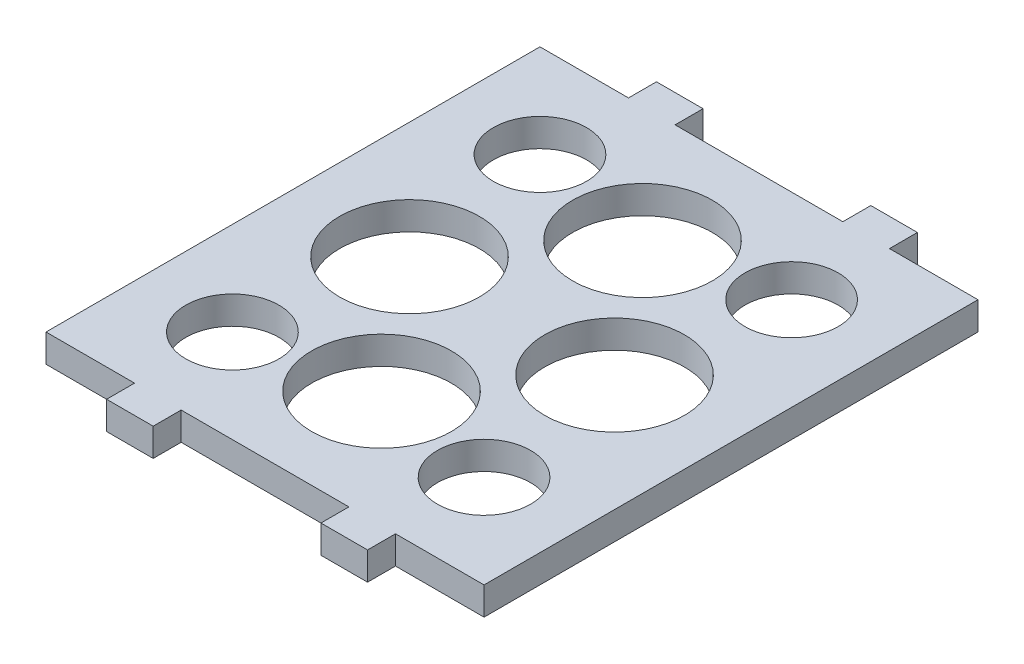
ISO-10303-21;
HEADER;
FILE_DESCRIPTION(('STEP AP214'),'2;1');
FILE_NAME('part.step','',(''),(''),'','','');
FILE_SCHEMA(('AUTOMOTIVE_DESIGN { 1 0 10303 214 1 1 1 1 }'));
ENDSEC;
DATA;
#1=APPLICATION_CONTEXT('core data for automotive mechanical design processes');
#2=APPLICATION_PROTOCOL_DEFINITION('international standard','automotive_design',2000,#1);
#3=PRODUCT_CONTEXT('',#1,'mechanical');
#4=PRODUCT('Part','Part','',(#3));
#5=PRODUCT_RELATED_PRODUCT_CATEGORY('part','',(#4));
#6=PRODUCT_DEFINITION_FORMATION('','',#4);
#7=PRODUCT_DEFINITION_CONTEXT('part definition',#1,'design');
#8=PRODUCT_DEFINITION('design','',#6,#7);
#9=PRODUCT_DEFINITION_SHAPE('','',#8);
#10=(LENGTH_UNIT() NAMED_UNIT(*) SI_UNIT(.MILLI.,.METRE.));
#11=(NAMED_UNIT(*) PLANE_ANGLE_UNIT() SI_UNIT($,.RADIAN.));
#12=(NAMED_UNIT(*) SI_UNIT($,.STERADIAN.) SOLID_ANGLE_UNIT());
#13=UNCERTAINTY_MEASURE_WITH_UNIT(LENGTH_MEASURE(1.E-05),#10,'distance_accuracy_value','');
#14=(GEOMETRIC_REPRESENTATION_CONTEXT(3) GLOBAL_UNCERTAINTY_ASSIGNED_CONTEXT((#13)) GLOBAL_UNIT_ASSIGNED_CONTEXT((#10,
#11,#12)) REPRESENTATION_CONTEXT('',''));
#15=CARTESIAN_POINT('',(0.,0.,0.));
#16=DIRECTION('',(0.,0.,1.));
#17=DIRECTION('',(1.,0.,0.));
#18=AXIS2_PLACEMENT_3D('',#15,#16,#17);
#19=CARTESIAN_POINT('',(0.,6.,0.));
#20=DIRECTION('',(0.,-1.,0.));
#21=DIRECTION('',(0.,0.,-1.));
#22=AXIS2_PLACEMENT_3D('',#19,#20,#21);
#23=PLANE('',#22);
#24=CARTESIAN_POINT('',(74.,6.,-86.));
#25=DIRECTION('',(0.,1.,0.));
#26=DIRECTION('',(0.,0.,1.));
#27=AXIS2_PLACEMENT_3D('',#24,#25,#26);
#28=CIRCLE('',#27,9.99999999999999);
#29=CARTESIAN_POINT('',(74.,6.,-76.));
#30=VERTEX_POINT('',#29);
#31=EDGE_CURVE('E411',#30,#30,#28,.T.);
#32=ORIENTED_EDGE('',*,*,#31,.F.);
#33=EDGE_LOOP('',(#32));
#34=FACE_BOUND('',#33,.T.);
#35=CARTESIAN_POINT('',(20.,6.,-20.));
#36=DIRECTION('',(0.,1.,0.));
#37=DIRECTION('',(0.,0.,1.));
#38=AXIS2_PLACEMENT_3D('',#35,#36,#37);
#39=CIRCLE('',#38,10.);
#40=CARTESIAN_POINT('',(20.,6.,-9.99999999999999));
#41=VERTEX_POINT('',#40);
#42=EDGE_CURVE('E423',#41,#41,#39,.T.);
#43=ORIENTED_EDGE('',*,*,#42,.F.);
#44=EDGE_LOOP('',(#43));
#45=FACE_BOUND('',#44,.T.);
#46=CARTESIAN_POINT('',(47.,6.,-81.));
#47=DIRECTION('',(0.,1.,0.));
#48=DIRECTION('',(0.,0.,1.));
#49=AXIS2_PLACEMENT_3D('',#46,#47,#48);
#50=CIRCLE('',#49,15.);
#51=CARTESIAN_POINT('',(47.,6.,-66.));
#52=VERTEX_POINT('',#51);
#53=EDGE_CURVE('E435',#52,#52,#50,.T.);
#54=ORIENTED_EDGE('',*,*,#53,.F.);
#55=EDGE_LOOP('',(#54));
#56=FACE_BOUND('',#55,.T.);
#57=CARTESIAN_POINT('',(25.,6.,-53.));
#58=DIRECTION('',(0.,1.,0.));
#59=DIRECTION('',(0.,0.,1.));
#60=AXIS2_PLACEMENT_3D('',#57,#58,#59);
#61=CIRCLE('',#60,15.);
#62=CARTESIAN_POINT('',(25.,6.,-38.));
#63=VERTEX_POINT('',#62);
#64=EDGE_CURVE('E205',#63,#63,#61,.T.);
#65=ORIENTED_EDGE('',*,*,#64,.F.);
#66=EDGE_LOOP('',(#65));
#67=FACE_BOUND('',#66,.T.);
#68=DIRECTION('',(0.,0.,1.));
#69=VECTOR('',#68,1.);
#70=CARTESIAN_POINT('',(0.,6.,0.));
#71=LINE('',#70,#69);
#72=CARTESIAN_POINT('',(0.,6.,-106.));
#73=VERTEX_POINT('',#72);
#74=CARTESIAN_POINT('',(0.,6.,0.));
#75=VERTEX_POINT('',#74);
#76=EDGE_CURVE('E240',#73,#75,#71,.T.);
#77=ORIENTED_EDGE('',*,*,#76,.T.);
#78=DIRECTION('',(1.,0.,0.));
#79=VECTOR('',#78,1.);
#80=CARTESIAN_POINT('',(0.,6.,0.));
#81=LINE('',#80,#79);
#82=CARTESIAN_POINT('',(19.,6.,0.));
#83=VERTEX_POINT('',#82);
#84=EDGE_CURVE('E128',#75,#83,#81,.T.);
#85=ORIENTED_EDGE('',*,*,#84,.T.);
#86=DIRECTION('',(0.,0.,1.));
#87=VECTOR('',#86,1.);
#88=CARTESIAN_POINT('',(19.,6.,0.));
#89=LINE('',#88,#87);
#90=CARTESIAN_POINT('',(19.,6.,6.));
#91=VERTEX_POINT('',#90);
#92=EDGE_CURVE('E291',#83,#91,#89,.T.);
#93=ORIENTED_EDGE('',*,*,#92,.T.);
#94=DIRECTION('',(1.,0.,0.));
#95=VECTOR('',#94,1.);
#96=CARTESIAN_POINT('',(19.,6.,6.));
#97=LINE('',#96,#95);
#98=CARTESIAN_POINT('',(29.,6.,6.));
#99=VERTEX_POINT('',#98);
#100=EDGE_CURVE('E310',#91,#99,#97,.T.);
#101=ORIENTED_EDGE('',*,*,#100,.T.);
#102=DIRECTION('',(0.,0.,-1.));
#103=VECTOR('',#102,1.);
#104=CARTESIAN_POINT('',(29.,6.,6.));
#105=LINE('',#104,#103);
#106=CARTESIAN_POINT('',(29.,6.,0.));
#107=VERTEX_POINT('',#106);
#108=EDGE_CURVE('E307',#99,#107,#105,.T.);
#109=ORIENTED_EDGE('',*,*,#108,.T.);
#110=DIRECTION('',(1.,0.,0.));
#111=VECTOR('',#110,1.);
#112=CARTESIAN_POINT('',(29.,6.,0.));
#113=LINE('',#112,#111);
#114=CARTESIAN_POINT('',(65.,6.,0.));
#115=VERTEX_POINT('',#114);
#116=EDGE_CURVE('E309',#107,#115,#113,.T.);
#117=ORIENTED_EDGE('',*,*,#116,.T.);
#118=DIRECTION('',(0.,0.,1.));
#119=VECTOR('',#118,1.);
#120=CARTESIAN_POINT('',(65.,6.,0.));
#121=LINE('',#120,#119);
#122=CARTESIAN_POINT('',(65.,6.,6.));
#123=VERTEX_POINT('',#122);
#124=EDGE_CURVE('E312',#115,#123,#121,.T.);
#125=ORIENTED_EDGE('',*,*,#124,.T.);
#126=DIRECTION('',(1.,0.,0.));
#127=VECTOR('',#126,1.);
#128=CARTESIAN_POINT('',(65.,6.,6.));
#129=LINE('',#128,#127);
#130=CARTESIAN_POINT('',(75.,6.,6.));
#131=VERTEX_POINT('',#130);
#132=EDGE_CURVE('E318',#123,#131,#129,.T.);
#133=ORIENTED_EDGE('',*,*,#132,.T.);
#134=DIRECTION('',(0.,0.,-1.));
#135=VECTOR('',#134,1.);
#136=CARTESIAN_POINT('',(75.,6.,6.));
#137=LINE('',#136,#135);
#138=CARTESIAN_POINT('',(75.,6.,0.));
#139=VERTEX_POINT('',#138);
#140=EDGE_CURVE('E320',#131,#139,#137,.T.);
#141=ORIENTED_EDGE('',*,*,#140,.T.);
#142=DIRECTION('',(1.,0.,0.));
#143=VECTOR('',#142,1.);
#144=CARTESIAN_POINT('',(75.,6.,0.));
#145=LINE('',#144,#143);
#146=CARTESIAN_POINT('',(94.,6.,0.));
#147=VERTEX_POINT('',#146);
#148=EDGE_CURVE('E322',#139,#147,#145,.T.);
#149=ORIENTED_EDGE('',*,*,#148,.T.);
#150=DIRECTION('',(0.,0.,-1.));
#151=VECTOR('',#150,1.);
#152=CARTESIAN_POINT('',(94.,6.,0.));
#153=LINE('',#152,#151);
#154=CARTESIAN_POINT('',(94.,6.,-106.));
#155=VERTEX_POINT('',#154);
#156=EDGE_CURVE('E324',#147,#155,#153,.T.);
#157=ORIENTED_EDGE('',*,*,#156,.T.);
#158=DIRECTION('',(-1.,0.,0.));
#159=VECTOR('',#158,1.);
#160=CARTESIAN_POINT('',(75.,6.,-106.));
#161=LINE('',#160,#159);
#162=CARTESIAN_POINT('',(75.,6.,-106.));
#163=VERTEX_POINT('',#162);
#164=EDGE_CURVE('E326',#155,#163,#161,.T.);
#165=ORIENTED_EDGE('',*,*,#164,.T.);
#166=DIRECTION('',(0.,0.,-1.));
#167=VECTOR('',#166,1.);
#168=CARTESIAN_POINT('',(75.,6.,-112.));
#169=LINE('',#168,#167);
#170=CARTESIAN_POINT('',(75.,6.,-112.));
#171=VERTEX_POINT('',#170);
#172=EDGE_CURVE('E328',#163,#171,#169,.T.);
#173=ORIENTED_EDGE('',*,*,#172,.T.);
#174=DIRECTION('',(-1.,0.,0.));
#175=VECTOR('',#174,1.);
#176=CARTESIAN_POINT('',(65.,6.,-112.));
#177=LINE('',#176,#175);
#178=CARTESIAN_POINT('',(65.,6.,-112.));
#179=VERTEX_POINT('',#178);
#180=EDGE_CURVE('E330',#171,#179,#177,.T.);
#181=ORIENTED_EDGE('',*,*,#180,.T.);
#182=DIRECTION('',(0.,0.,1.));
#183=VECTOR('',#182,1.);
#184=CARTESIAN_POINT('',(65.,6.,-106.));
#185=LINE('',#184,#183);
#186=CARTESIAN_POINT('',(65.,6.,-106.));
#187=VERTEX_POINT('',#186);
#188=EDGE_CURVE('E332',#179,#187,#185,.T.);
#189=ORIENTED_EDGE('',*,*,#188,.T.);
#190=DIRECTION('',(-1.,0.,0.));
#191=VECTOR('',#190,1.);
#192=CARTESIAN_POINT('',(29.,6.,-106.));
#193=LINE('',#192,#191);
#194=CARTESIAN_POINT('',(29.,6.,-106.));
#195=VERTEX_POINT('',#194);
#196=EDGE_CURVE('E334',#187,#195,#193,.T.);
#197=ORIENTED_EDGE('',*,*,#196,.T.);
#198=DIRECTION('',(0.,0.,-1.));
#199=VECTOR('',#198,1.);
#200=CARTESIAN_POINT('',(29.,6.,-112.));
#201=LINE('',#200,#199);
#202=CARTESIAN_POINT('',(29.,6.,-112.));
#203=VERTEX_POINT('',#202);
#204=EDGE_CURVE('E183',#195,#203,#201,.T.);
#205=ORIENTED_EDGE('',*,*,#204,.T.);
#206=DIRECTION('',(-1.,0.,0.));
#207=VECTOR('',#206,1.);
#208=CARTESIAN_POINT('',(19.,6.,-112.));
#209=LINE('',#208,#207);
#210=CARTESIAN_POINT('',(19.,6.,-112.));
#211=VERTEX_POINT('',#210);
#212=EDGE_CURVE('E177',#203,#211,#209,.T.);
#213=ORIENTED_EDGE('',*,*,#212,.T.);
#214=DIRECTION('',(0.,0.,1.));
#215=VECTOR('',#214,1.);
#216=CARTESIAN_POINT('',(19.,6.,-106.));
#217=LINE('',#216,#215);
#218=CARTESIAN_POINT('',(19.,6.,-106.));
#219=VERTEX_POINT('',#218);
#220=EDGE_CURVE('E181',#211,#219,#217,.T.);
#221=ORIENTED_EDGE('',*,*,#220,.T.);
#222=DIRECTION('',(-1.,0.,0.));
#223=VECTOR('',#222,1.);
#224=CARTESIAN_POINT('',(0.,6.,-106.));
#225=LINE('',#224,#223);
#226=EDGE_CURVE('E49',#219,#73,#225,.T.);
#227=ORIENTED_EDGE('',*,*,#226,.T.);
#228=EDGE_LOOP('',(#77,#85,#93,#101,#109,#117,#125,#133,#141,#149,#157,#165,#173,#181,#189,#197,
#205,#213,#221,#227));
#229=FACE_BOUND('',#228,.T.);
#230=CARTESIAN_POINT('',(69.,6.,-53.));
#231=DIRECTION('',(0.,1.,0.));
#232=DIRECTION('',(0.,0.,1.));
#233=AXIS2_PLACEMENT_3D('',#230,#231,#232);
#234=CIRCLE('',#233,15.);
#235=CARTESIAN_POINT('',(69.,6.,-38.));
#236=VERTEX_POINT('',#235);
#237=EDGE_CURVE('E441',#236,#236,#234,.T.);
#238=ORIENTED_EDGE('',*,*,#237,.F.);
#239=EDGE_LOOP('',(#238));
#240=FACE_BOUND('',#239,.T.);
#241=CARTESIAN_POINT('',(47.,6.,-25.));
#242=DIRECTION('',(0.,1.,0.));
#243=DIRECTION('',(0.,0.,1.));
#244=AXIS2_PLACEMENT_3D('',#241,#242,#243);
#245=CIRCLE('',#244,15.);
#246=CARTESIAN_POINT('',(47.,6.,-10.));
#247=VERTEX_POINT('',#246);
#248=EDGE_CURVE('E429',#247,#247,#245,.T.);
#249=ORIENTED_EDGE('',*,*,#248,.F.);
#250=EDGE_LOOP('',(#249));
#251=FACE_BOUND('',#250,.T.);
#252=CARTESIAN_POINT('',(20.,6.,-86.));
#253=DIRECTION('',(0.,1.,0.));
#254=DIRECTION('',(0.,0.,1.));
#255=AXIS2_PLACEMENT_3D('',#252,#253,#254);
#256=CIRCLE('',#255,9.99999999999999);
#257=CARTESIAN_POINT('',(20.,6.,-76.));
#258=VERTEX_POINT('',#257);
#259=EDGE_CURVE('E417',#258,#258,#256,.T.);
#260=ORIENTED_EDGE('',*,*,#259,.F.);
#261=EDGE_LOOP('',(#260));
#262=FACE_BOUND('',#261,.T.);
#263=CARTESIAN_POINT('',(74.,6.,-20.));
#264=DIRECTION('',(0.,1.,0.));
#265=DIRECTION('',(0.,0.,1.));
#266=AXIS2_PLACEMENT_3D('',#263,#264,#265);
#267=CIRCLE('',#266,9.99999999999999);
#268=CARTESIAN_POINT('',(74.,6.,-10.));
#269=VERTEX_POINT('',#268);
#270=EDGE_CURVE('E402',#269,#269,#267,.T.);
#271=ORIENTED_EDGE('',*,*,#270,.F.);
#272=EDGE_LOOP('',(#271));
#273=FACE_BOUND('',#272,.T.);
#274=ADVANCED_FACE('F32',(#34,#45,#56,#67,#229,#240,#251,#262,#273),#23,.F.);
#275=CARTESIAN_POINT('',(0.,0.,0.));
#276=DIRECTION('',(0.,-1.,0.));
#277=DIRECTION('',(0.,0.,-1.));
#278=AXIS2_PLACEMENT_3D('',#275,#276,#277);
#279=PLANE('',#278);
#280=CARTESIAN_POINT('',(74.,0.,-86.));
#281=DIRECTION('',(0.,1.,0.));
#282=DIRECTION('',(0.,0.,1.));
#283=AXIS2_PLACEMENT_3D('',#280,#281,#282);
#284=CIRCLE('',#283,9.99999999999999);
#285=CARTESIAN_POINT('',(74.,0.,-76.));
#286=VERTEX_POINT('',#285);
#287=EDGE_CURVE('E408',#286,#286,#284,.T.);
#288=ORIENTED_EDGE('',*,*,#287,.T.);
#289=EDGE_LOOP('',(#288));
#290=FACE_BOUND('',#289,.T.);
#291=CARTESIAN_POINT('',(20.,0.,-20.));
#292=DIRECTION('',(0.,1.,0.));
#293=DIRECTION('',(0.,0.,1.));
#294=AXIS2_PLACEMENT_3D('',#291,#292,#293);
#295=CIRCLE('',#294,10.);
#296=CARTESIAN_POINT('',(20.,0.,-9.99999999999999));
#297=VERTEX_POINT('',#296);
#298=EDGE_CURVE('E420',#297,#297,#295,.T.);
#299=ORIENTED_EDGE('',*,*,#298,.T.);
#300=EDGE_LOOP('',(#299));
#301=FACE_BOUND('',#300,.T.);
#302=CARTESIAN_POINT('',(47.,0.,-81.));
#303=DIRECTION('',(0.,1.,0.));
#304=DIRECTION('',(0.,0.,1.));
#305=AXIS2_PLACEMENT_3D('',#302,#303,#304);
#306=CIRCLE('',#305,15.);
#307=CARTESIAN_POINT('',(47.,0.,-66.));
#308=VERTEX_POINT('',#307);
#309=EDGE_CURVE('E432',#308,#308,#306,.T.);
#310=ORIENTED_EDGE('',*,*,#309,.T.);
#311=EDGE_LOOP('',(#310));
#312=FACE_BOUND('',#311,.T.);
#313=CARTESIAN_POINT('',(25.,0.,-53.));
#314=DIRECTION('',(0.,1.,0.));
#315=DIRECTION('',(0.,0.,1.));
#316=AXIS2_PLACEMENT_3D('',#313,#314,#315);
#317=CIRCLE('',#316,15.);
#318=CARTESIAN_POINT('',(25.,0.,-38.));
#319=VERTEX_POINT('',#318);
#320=EDGE_CURVE('E444',#319,#319,#317,.T.);
#321=ORIENTED_EDGE('',*,*,#320,.T.);
#322=EDGE_LOOP('',(#321));
#323=FACE_BOUND('',#322,.T.);
#324=DIRECTION('',(0.,0.,1.));
#325=VECTOR('',#324,1.);
#326=CARTESIAN_POINT('',(0.,0.,0.));
#327=LINE('',#326,#325);
#328=CARTESIAN_POINT('',(0.,0.,-106.));
#329=VERTEX_POINT('',#328);
#330=CARTESIAN_POINT('',(0.,0.,0.));
#331=VERTEX_POINT('',#330);
#332=EDGE_CURVE('E201',#329,#331,#327,.T.);
#333=ORIENTED_EDGE('',*,*,#332,.F.);
#334=DIRECTION('',(-1.,0.,0.));
#335=VECTOR('',#334,1.);
#336=CARTESIAN_POINT('',(0.,0.,-106.));
#337=LINE('',#336,#335);
#338=CARTESIAN_POINT('',(19.,0.,-106.));
#339=VERTEX_POINT('',#338);
#340=EDGE_CURVE('E120',#339,#329,#337,.T.);
#341=ORIENTED_EDGE('',*,*,#340,.F.);
#342=DIRECTION('',(0.,0.,1.));
#343=VECTOR('',#342,1.);
#344=CARTESIAN_POINT('',(19.,0.,-106.));
#345=LINE('',#344,#343);
#346=CARTESIAN_POINT('',(19.,0.,-112.));
#347=VERTEX_POINT('',#346);
#348=EDGE_CURVE('E114',#347,#339,#345,.T.);
#349=ORIENTED_EDGE('',*,*,#348,.F.);
#350=DIRECTION('',(-1.,0.,0.));
#351=VECTOR('',#350,1.);
#352=CARTESIAN_POINT('',(19.,0.,-112.));
#353=LINE('',#352,#351);
#354=CARTESIAN_POINT('',(29.,0.,-112.));
#355=VERTEX_POINT('',#354);
#356=EDGE_CURVE('E191',#355,#347,#353,.T.);
#357=ORIENTED_EDGE('',*,*,#356,.F.);
#358=DIRECTION('',(0.,0.,-1.));
#359=VECTOR('',#358,1.);
#360=CARTESIAN_POINT('',(29.,0.,-112.));
#361=LINE('',#360,#359);
#362=CARTESIAN_POINT('',(29.,0.,-106.));
#363=VERTEX_POINT('',#362);
#364=EDGE_CURVE('E235',#363,#355,#361,.T.);
#365=ORIENTED_EDGE('',*,*,#364,.F.);
#366=DIRECTION('',(-1.,0.,0.));
#367=VECTOR('',#366,1.);
#368=CARTESIAN_POINT('',(29.,0.,-106.));
#369=LINE('',#368,#367);
#370=CARTESIAN_POINT('',(65.,0.,-106.));
#371=VERTEX_POINT('',#370);
#372=EDGE_CURVE('E233',#371,#363,#369,.T.);
#373=ORIENTED_EDGE('',*,*,#372,.F.);
#374=DIRECTION('',(0.,0.,1.));
#375=VECTOR('',#374,1.);
#376=CARTESIAN_POINT('',(65.,0.,-106.));
#377=LINE('',#376,#375);
#378=CARTESIAN_POINT('',(65.,0.,-112.));
#379=VERTEX_POINT('',#378);
#380=EDGE_CURVE('E231',#379,#371,#377,.T.);
#381=ORIENTED_EDGE('',*,*,#380,.F.);
#382=DIRECTION('',(-1.,0.,0.));
#383=VECTOR('',#382,1.);
#384=CARTESIAN_POINT('',(65.,0.,-112.));
#385=LINE('',#384,#383);
#386=CARTESIAN_POINT('',(75.,0.,-112.));
#387=VERTEX_POINT('',#386);
#388=EDGE_CURVE('E229',#387,#379,#385,.T.);
#389=ORIENTED_EDGE('',*,*,#388,.F.);
#390=DIRECTION('',(0.,0.,-1.));
#391=VECTOR('',#390,1.);
#392=CARTESIAN_POINT('',(75.,0.,-112.));
#393=LINE('',#392,#391);
#394=CARTESIAN_POINT('',(75.,0.,-106.));
#395=VERTEX_POINT('',#394);
#396=EDGE_CURVE('E227',#395,#387,#393,.T.);
#397=ORIENTED_EDGE('',*,*,#396,.F.);
#398=DIRECTION('',(-1.,0.,0.));
#399=VECTOR('',#398,1.);
#400=CARTESIAN_POINT('',(75.,0.,-106.));
#401=LINE('',#400,#399);
#402=CARTESIAN_POINT('',(94.,0.,-106.));
#403=VERTEX_POINT('',#402);
#404=EDGE_CURVE('E225',#403,#395,#401,.T.);
#405=ORIENTED_EDGE('',*,*,#404,.F.);
#406=DIRECTION('',(0.,0.,-1.));
#407=VECTOR('',#406,1.);
#408=CARTESIAN_POINT('',(94.,0.,0.));
#409=LINE('',#408,#407);
#410=CARTESIAN_POINT('',(94.,0.,0.));
#411=VERTEX_POINT('',#410);
#412=EDGE_CURVE('E223',#411,#403,#409,.T.);
#413=ORIENTED_EDGE('',*,*,#412,.F.);
#414=DIRECTION('',(1.,0.,0.));
#415=VECTOR('',#414,1.);
#416=CARTESIAN_POINT('',(75.,0.,0.));
#417=LINE('',#416,#415);
#418=CARTESIAN_POINT('',(75.,0.,0.));
#419=VERTEX_POINT('',#418);
#420=EDGE_CURVE('E221',#419,#411,#417,.T.);
#421=ORIENTED_EDGE('',*,*,#420,.F.);
#422=DIRECTION('',(0.,0.,-1.));
#423=VECTOR('',#422,1.);
#424=CARTESIAN_POINT('',(75.,0.,6.));
#425=LINE('',#424,#423);
#426=CARTESIAN_POINT('',(75.,0.,6.));
#427=VERTEX_POINT('',#426);
#428=EDGE_CURVE('E219',#427,#419,#425,.T.);
#429=ORIENTED_EDGE('',*,*,#428,.F.);
#430=DIRECTION('',(1.,0.,0.));
#431=VECTOR('',#430,1.);
#432=CARTESIAN_POINT('',(65.,0.,6.));
#433=LINE('',#432,#431);
#434=CARTESIAN_POINT('',(65.,0.,6.));
#435=VERTEX_POINT('',#434);
#436=EDGE_CURVE('E217',#435,#427,#433,.T.);
#437=ORIENTED_EDGE('',*,*,#436,.F.);
#438=DIRECTION('',(0.,0.,1.));
#439=VECTOR('',#438,1.);
#440=CARTESIAN_POINT('',(65.,0.,0.));
#441=LINE('',#440,#439);
#442=CARTESIAN_POINT('',(65.,0.,0.));
#443=VERTEX_POINT('',#442);
#444=EDGE_CURVE('E215',#443,#435,#441,.T.);
#445=ORIENTED_EDGE('',*,*,#444,.F.);
#446=DIRECTION('',(1.,0.,0.));
#447=VECTOR('',#446,1.);
#448=CARTESIAN_POINT('',(29.,0.,0.));
#449=LINE('',#448,#447);
#450=CARTESIAN_POINT('',(29.,0.,0.));
#451=VERTEX_POINT('',#450);
#452=EDGE_CURVE('E213',#451,#443,#449,.T.);
#453=ORIENTED_EDGE('',*,*,#452,.F.);
#454=DIRECTION('',(0.,0.,-1.));
#455=VECTOR('',#454,1.);
#456=CARTESIAN_POINT('',(29.,0.,6.));
#457=LINE('',#456,#455);
#458=CARTESIAN_POINT('',(29.,0.,6.));
#459=VERTEX_POINT('',#458);
#460=EDGE_CURVE('E211',#459,#451,#457,.T.);
#461=ORIENTED_EDGE('',*,*,#460,.F.);
#462=DIRECTION('',(1.,0.,0.));
#463=VECTOR('',#462,1.);
#464=CARTESIAN_POINT('',(19.,0.,6.));
#465=LINE('',#464,#463);
#466=CARTESIAN_POINT('',(19.,0.,6.));
#467=VERTEX_POINT('',#466);
#468=EDGE_CURVE('E209',#467,#459,#465,.T.);
#469=ORIENTED_EDGE('',*,*,#468,.F.);
#470=DIRECTION('',(0.,0.,1.));
#471=VECTOR('',#470,1.);
#472=CARTESIAN_POINT('',(19.,0.,0.));
#473=LINE('',#472,#471);
#474=CARTESIAN_POINT('',(19.,0.,0.));
#475=VERTEX_POINT('',#474);
#476=EDGE_CURVE('E207',#475,#467,#473,.T.);
#477=ORIENTED_EDGE('',*,*,#476,.F.);
#478=DIRECTION('',(1.,0.,0.));
#479=VECTOR('',#478,1.);
#480=CARTESIAN_POINT('',(0.,0.,0.));
#481=LINE('',#480,#479);
#482=EDGE_CURVE('E204',#331,#475,#481,.T.);
#483=ORIENTED_EDGE('',*,*,#482,.F.);
#484=EDGE_LOOP('',(#333,#341,#349,#357,#365,#373,#381,#389,#397,#405,#413,#421,#429,#437,#445,
#453,#461,#469,#477,#483));
#485=FACE_BOUND('',#484,.T.);
#486=CARTESIAN_POINT('',(69.,0.,-53.));
#487=DIRECTION('',(0.,1.,0.));
#488=DIRECTION('',(0.,0.,1.));
#489=AXIS2_PLACEMENT_3D('',#486,#487,#488);
#490=CIRCLE('',#489,15.);
#491=CARTESIAN_POINT('',(69.,0.,-38.));
#492=VERTEX_POINT('',#491);
#493=EDGE_CURVE('E438',#492,#492,#490,.T.);
#494=ORIENTED_EDGE('',*,*,#493,.T.);
#495=EDGE_LOOP('',(#494));
#496=FACE_BOUND('',#495,.T.);
#497=CARTESIAN_POINT('',(47.,0.,-25.));
#498=DIRECTION('',(0.,1.,0.));
#499=DIRECTION('',(0.,0.,1.));
#500=AXIS2_PLACEMENT_3D('',#497,#498,#499);
#501=CIRCLE('',#500,15.);
#502=CARTESIAN_POINT('',(47.,0.,-10.));
#503=VERTEX_POINT('',#502);
#504=EDGE_CURVE('E426',#503,#503,#501,.T.);
#505=ORIENTED_EDGE('',*,*,#504,.T.);
#506=EDGE_LOOP('',(#505));
#507=FACE_BOUND('',#506,.T.);
#508=CARTESIAN_POINT('',(20.,0.,-86.));
#509=DIRECTION('',(0.,1.,0.));
#510=DIRECTION('',(0.,0.,1.));
#511=AXIS2_PLACEMENT_3D('',#508,#509,#510);
#512=CIRCLE('',#511,9.99999999999999);
#513=CARTESIAN_POINT('',(20.,0.,-76.));
#514=VERTEX_POINT('',#513);
#515=EDGE_CURVE('E414',#514,#514,#512,.T.);
#516=ORIENTED_EDGE('',*,*,#515,.T.);
#517=EDGE_LOOP('',(#516));
#518=FACE_BOUND('',#517,.T.);
#519=CARTESIAN_POINT('',(74.,0.,-20.));
#520=DIRECTION('',(0.,1.,0.));
#521=DIRECTION('',(0.,0.,1.));
#522=AXIS2_PLACEMENT_3D('',#519,#520,#521);
#523=CIRCLE('',#522,9.99999999999999);
#524=CARTESIAN_POINT('',(74.,0.,-10.));
#525=VERTEX_POINT('',#524);
#526=EDGE_CURVE('E405',#525,#525,#523,.T.);
#527=ORIENTED_EDGE('',*,*,#526,.T.);
#528=EDGE_LOOP('',(#527));
#529=FACE_BOUND('',#528,.T.);
#530=ADVANCED_FACE('F295',(#290,#301,#312,#323,#485,#496,#507,#518,#529),#279,.T.);
#531=CARTESIAN_POINT('',(0.,6.,0.));
#532=DIRECTION('',(1.,0.,0.));
#533=DIRECTION('',(0.,0.,-1.));
#534=AXIS2_PLACEMENT_3D('',#531,#532,#533);
#535=PLANE('',#534);
#536=ORIENTED_EDGE('',*,*,#332,.T.);
#537=DIRECTION('',(0.,-1.,0.));
#538=VECTOR('',#537,1.);
#539=CARTESIAN_POINT('',(0.,6.,0.));
#540=LINE('',#539,#538);
#541=EDGE_CURVE('E11',#75,#331,#540,.T.);
#542=ORIENTED_EDGE('',*,*,#541,.F.);
#543=ORIENTED_EDGE('',*,*,#76,.F.);
#544=DIRECTION('',(0.,-1.,0.));
#545=VECTOR('',#544,1.);
#546=CARTESIAN_POINT('',(0.,6.,-106.));
#547=LINE('',#546,#545);
#548=EDGE_CURVE('E197',#73,#329,#547,.T.);
#549=ORIENTED_EDGE('',*,*,#548,.T.);
#550=EDGE_LOOP('',(#536,#542,#543,#549));
#551=FACE_BOUND('',#550,.T.);
#552=ADVANCED_FACE('F34',(#551),#535,.F.);
#553=CARTESIAN_POINT('',(0.,6.,0.));
#554=DIRECTION('',(0.,0.,-1.));
#555=DIRECTION('',(-1.,0.,0.));
#556=AXIS2_PLACEMENT_3D('',#553,#554,#555);
#557=PLANE('',#556);
#558=ORIENTED_EDGE('',*,*,#482,.T.);
#559=DIRECTION('',(0.,-1.,0.));
#560=VECTOR('',#559,1.);
#561=CARTESIAN_POINT('',(19.,6.,0.));
#562=LINE('',#561,#560);
#563=EDGE_CURVE('E41',#83,#475,#562,.T.);
#564=ORIENTED_EDGE('',*,*,#563,.F.);
#565=ORIENTED_EDGE('',*,*,#84,.F.);
#566=ORIENTED_EDGE('',*,*,#541,.T.);
#567=EDGE_LOOP('',(#558,#564,#565,#566));
#568=FACE_BOUND('',#567,.T.);
#569=ADVANCED_FACE('F669',(#568),#557,.F.);
#570=CARTESIAN_POINT('',(19.,6.,0.));
#571=DIRECTION('',(1.,0.,0.));
#572=DIRECTION('',(0.,0.,-1.));
#573=AXIS2_PLACEMENT_3D('',#570,#571,#572);
#574=PLANE('',#573);
#575=ORIENTED_EDGE('',*,*,#476,.T.);
#576=DIRECTION('',(0.,-1.,0.));
#577=VECTOR('',#576,1.);
#578=CARTESIAN_POINT('',(19.,6.,6.));
#579=LINE('',#578,#577);
#580=EDGE_CURVE('E283',#91,#467,#579,.T.);
#581=ORIENTED_EDGE('',*,*,#580,.F.);
#582=ORIENTED_EDGE('',*,*,#92,.F.);
#583=ORIENTED_EDGE('',*,*,#563,.T.);
#584=EDGE_LOOP('',(#575,#581,#582,#583));
#585=FACE_BOUND('',#584,.T.);
#586=ADVANCED_FACE('F289',(#585),#574,.F.);
#587=CARTESIAN_POINT('',(19.,6.,6.));
#588=DIRECTION('',(0.,0.,-1.));
#589=DIRECTION('',(-1.,0.,0.));
#590=AXIS2_PLACEMENT_3D('',#587,#588,#589);
#591=PLANE('',#590);
#592=ORIENTED_EDGE('',*,*,#468,.T.);
#593=DIRECTION('',(0.,-1.,0.));
#594=VECTOR('',#593,1.);
#595=CARTESIAN_POINT('',(29.,6.,6.));
#596=LINE('',#595,#594);
#597=EDGE_CURVE('E280',#99,#459,#596,.T.);
#598=ORIENTED_EDGE('',*,*,#597,.F.);
#599=ORIENTED_EDGE('',*,*,#100,.F.);
#600=ORIENTED_EDGE('',*,*,#580,.T.);
#601=EDGE_LOOP('',(#592,#598,#599,#600));
#602=FACE_BOUND('',#601,.T.);
#603=ADVANCED_FACE('F301',(#602),#591,.F.);
#604=CARTESIAN_POINT('',(29.,6.,6.));
#605=DIRECTION('',(-1.,0.,0.));
#606=DIRECTION('',(0.,0.,1.));
#607=AXIS2_PLACEMENT_3D('',#604,#605,#606);
#608=PLANE('',#607);
#609=ORIENTED_EDGE('',*,*,#460,.T.);
#610=DIRECTION('',(0.,-1.,0.));
#611=VECTOR('',#610,1.);
#612=CARTESIAN_POINT('',(29.,6.,0.));
#613=LINE('',#612,#611);
#614=EDGE_CURVE('E277',#107,#451,#613,.T.);
#615=ORIENTED_EDGE('',*,*,#614,.F.);
#616=ORIENTED_EDGE('',*,*,#108,.F.);
#617=ORIENTED_EDGE('',*,*,#597,.T.);
#618=EDGE_LOOP('',(#609,#615,#616,#617));
#619=FACE_BOUND('',#618,.T.);
#620=ADVANCED_FACE('F305',(#619),#608,.F.);
#621=CARTESIAN_POINT('',(29.,6.,0.));
#622=DIRECTION('',(0.,0.,-1.));
#623=DIRECTION('',(-1.,0.,0.));
#624=AXIS2_PLACEMENT_3D('',#621,#622,#623);
#625=PLANE('',#624);
#626=ORIENTED_EDGE('',*,*,#452,.T.);
#627=DIRECTION('',(0.,-1.,0.));
#628=VECTOR('',#627,1.);
#629=CARTESIAN_POINT('',(65.,6.,0.));
#630=LINE('',#629,#628);
#631=EDGE_CURVE('E274',#115,#443,#630,.T.);
#632=ORIENTED_EDGE('',*,*,#631,.F.);
#633=ORIENTED_EDGE('',*,*,#116,.F.);
#634=ORIENTED_EDGE('',*,*,#614,.T.);
#635=EDGE_LOOP('',(#626,#632,#633,#634));
#636=FACE_BOUND('',#635,.T.);
#637=ADVANCED_FACE('F634',(#636),#625,.F.);
#638=CARTESIAN_POINT('',(65.,6.,0.));
#639=DIRECTION('',(1.,0.,0.));
#640=DIRECTION('',(0.,0.,-1.));
#641=AXIS2_PLACEMENT_3D('',#638,#639,#640);
#642=PLANE('',#641);
#643=ORIENTED_EDGE('',*,*,#444,.T.);
#644=DIRECTION('',(0.,-1.,0.));
#645=VECTOR('',#644,1.);
#646=CARTESIAN_POINT('',(65.,6.,6.));
#647=LINE('',#646,#645);
#648=EDGE_CURVE('E271',#123,#435,#647,.T.);
#649=ORIENTED_EDGE('',*,*,#648,.F.);
#650=ORIENTED_EDGE('',*,*,#124,.F.);
#651=ORIENTED_EDGE('',*,*,#631,.T.);
#652=EDGE_LOOP('',(#643,#649,#650,#651));
#653=FACE_BOUND('',#652,.T.);
#654=ADVANCED_FACE('F624',(#653),#642,.F.);
#655=CARTESIAN_POINT('',(65.,6.,6.));
#656=DIRECTION('',(0.,0.,-1.));
#657=DIRECTION('',(-1.,0.,0.));
#658=AXIS2_PLACEMENT_3D('',#655,#656,#657);
#659=PLANE('',#658);
#660=ORIENTED_EDGE('',*,*,#436,.T.);
#661=DIRECTION('',(0.,-1.,0.));
#662=VECTOR('',#661,1.);
#663=CARTESIAN_POINT('',(75.,6.,6.));
#664=LINE('',#663,#662);
#665=EDGE_CURVE('E268',#131,#427,#664,.T.);
#666=ORIENTED_EDGE('',*,*,#665,.F.);
#667=ORIENTED_EDGE('',*,*,#132,.F.);
#668=ORIENTED_EDGE('',*,*,#648,.T.);
#669=EDGE_LOOP('',(#660,#666,#667,#668));
#670=FACE_BOUND('',#669,.T.);
#671=ADVANCED_FACE('F614',(#670),#659,.F.);
#672=CARTESIAN_POINT('',(75.,6.,6.));
#673=DIRECTION('',(-1.,0.,0.));
#674=DIRECTION('',(0.,0.,1.));
#675=AXIS2_PLACEMENT_3D('',#672,#673,#674);
#676=PLANE('',#675);
#677=ORIENTED_EDGE('',*,*,#428,.T.);
#678=DIRECTION('',(0.,-1.,0.));
#679=VECTOR('',#678,1.);
#680=CARTESIAN_POINT('',(75.,6.,0.));
#681=LINE('',#680,#679);
#682=EDGE_CURVE('E265',#139,#419,#681,.T.);
#683=ORIENTED_EDGE('',*,*,#682,.F.);
#684=ORIENTED_EDGE('',*,*,#140,.F.);
#685=ORIENTED_EDGE('',*,*,#665,.T.);
#686=EDGE_LOOP('',(#677,#683,#684,#685));
#687=FACE_BOUND('',#686,.T.);
#688=ADVANCED_FACE('F604',(#687),#676,.F.);
#689=CARTESIAN_POINT('',(75.,6.,0.));
#690=DIRECTION('',(0.,0.,-1.));
#691=DIRECTION('',(-1.,0.,0.));
#692=AXIS2_PLACEMENT_3D('',#689,#690,#691);
#693=PLANE('',#692);
#694=ORIENTED_EDGE('',*,*,#420,.T.);
#695=DIRECTION('',(0.,-1.,0.));
#696=VECTOR('',#695,1.);
#697=CARTESIAN_POINT('',(94.,6.,0.));
#698=LINE('',#697,#696);
#699=EDGE_CURVE('E262',#147,#411,#698,.T.);
#700=ORIENTED_EDGE('',*,*,#699,.F.);
#701=ORIENTED_EDGE('',*,*,#148,.F.);
#702=ORIENTED_EDGE('',*,*,#682,.T.);
#703=EDGE_LOOP('',(#694,#700,#701,#702));
#704=FACE_BOUND('',#703,.T.);
#705=ADVANCED_FACE('F594',(#704),#693,.F.);
#706=CARTESIAN_POINT('',(94.,6.,0.));
#707=DIRECTION('',(-1.,0.,0.));
#708=DIRECTION('',(0.,0.,1.));
#709=AXIS2_PLACEMENT_3D('',#706,#707,#708);
#710=PLANE('',#709);
#711=ORIENTED_EDGE('',*,*,#412,.T.);
#712=DIRECTION('',(0.,-1.,0.));
#713=VECTOR('',#712,1.);
#714=CARTESIAN_POINT('',(94.,6.,-106.));
#715=LINE('',#714,#713);
#716=EDGE_CURVE('E259',#155,#403,#715,.T.);
#717=ORIENTED_EDGE('',*,*,#716,.F.);
#718=ORIENTED_EDGE('',*,*,#156,.F.);
#719=ORIENTED_EDGE('',*,*,#699,.T.);
#720=EDGE_LOOP('',(#711,#717,#718,#719));
#721=FACE_BOUND('',#720,.T.);
#722=ADVANCED_FACE('F584',(#721),#710,.F.);
#723=CARTESIAN_POINT('',(75.,6.,-106.));
#724=DIRECTION('',(0.,0.,1.));
#725=DIRECTION('',(1.,0.,0.));
#726=AXIS2_PLACEMENT_3D('',#723,#724,#725);
#727=PLANE('',#726);
#728=ORIENTED_EDGE('',*,*,#404,.T.);
#729=DIRECTION('',(0.,-1.,0.));
#730=VECTOR('',#729,1.);
#731=CARTESIAN_POINT('',(75.,6.,-106.));
#732=LINE('',#731,#730);
#733=EDGE_CURVE('E256',#163,#395,#732,.T.);
#734=ORIENTED_EDGE('',*,*,#733,.F.);
#735=ORIENTED_EDGE('',*,*,#164,.F.);
#736=ORIENTED_EDGE('',*,*,#716,.T.);
#737=EDGE_LOOP('',(#728,#734,#735,#736));
#738=FACE_BOUND('',#737,.T.);
#739=ADVANCED_FACE('F574',(#738),#727,.F.);
#740=CARTESIAN_POINT('',(75.,6.,-112.));
#741=DIRECTION('',(-1.,0.,0.));
#742=DIRECTION('',(0.,0.,1.));
#743=AXIS2_PLACEMENT_3D('',#740,#741,#742);
#744=PLANE('',#743);
#745=ORIENTED_EDGE('',*,*,#396,.T.);
#746=DIRECTION('',(0.,-1.,0.));
#747=VECTOR('',#746,1.);
#748=CARTESIAN_POINT('',(75.,6.,-112.));
#749=LINE('',#748,#747);
#750=EDGE_CURVE('E253',#171,#387,#749,.T.);
#751=ORIENTED_EDGE('',*,*,#750,.F.);
#752=ORIENTED_EDGE('',*,*,#172,.F.);
#753=ORIENTED_EDGE('',*,*,#733,.T.);
#754=EDGE_LOOP('',(#745,#751,#752,#753));
#755=FACE_BOUND('',#754,.T.);
#756=ADVANCED_FACE('F564',(#755),#744,.F.);
#757=CARTESIAN_POINT('',(65.,6.,-112.));
#758=DIRECTION('',(0.,0.,1.));
#759=DIRECTION('',(1.,0.,0.));
#760=AXIS2_PLACEMENT_3D('',#757,#758,#759);
#761=PLANE('',#760);
#762=ORIENTED_EDGE('',*,*,#388,.T.);
#763=DIRECTION('',(0.,-1.,0.));
#764=VECTOR('',#763,1.);
#765=CARTESIAN_POINT('',(65.,6.,-112.));
#766=LINE('',#765,#764);
#767=EDGE_CURVE('E250',#179,#379,#766,.T.);
#768=ORIENTED_EDGE('',*,*,#767,.F.);
#769=ORIENTED_EDGE('',*,*,#180,.F.);
#770=ORIENTED_EDGE('',*,*,#750,.T.);
#771=EDGE_LOOP('',(#762,#768,#769,#770));
#772=FACE_BOUND('',#771,.T.);
#773=ADVANCED_FACE('F554',(#772),#761,.F.);
#774=CARTESIAN_POINT('',(65.,6.,-106.));
#775=DIRECTION('',(1.,0.,0.));
#776=DIRECTION('',(0.,0.,-1.));
#777=AXIS2_PLACEMENT_3D('',#774,#775,#776);
#778=PLANE('',#777);
#779=ORIENTED_EDGE('',*,*,#380,.T.);
#780=DIRECTION('',(0.,-1.,0.));
#781=VECTOR('',#780,1.);
#782=CARTESIAN_POINT('',(65.,6.,-106.));
#783=LINE('',#782,#781);
#784=EDGE_CURVE('E247',#187,#371,#783,.T.);
#785=ORIENTED_EDGE('',*,*,#784,.F.);
#786=ORIENTED_EDGE('',*,*,#188,.F.);
#787=ORIENTED_EDGE('',*,*,#767,.T.);
#788=EDGE_LOOP('',(#779,#785,#786,#787));
#789=FACE_BOUND('',#788,.T.);
#790=ADVANCED_FACE('F545',(#789),#778,.F.);
#791=CARTESIAN_POINT('',(29.,6.,-106.));
#792=DIRECTION('',(0.,0.,1.));
#793=DIRECTION('',(1.,0.,0.));
#794=AXIS2_PLACEMENT_3D('',#791,#792,#793);
#795=PLANE('',#794);
#796=ORIENTED_EDGE('',*,*,#372,.T.);
#797=DIRECTION('',(0.,-1.,0.));
#798=VECTOR('',#797,1.);
#799=CARTESIAN_POINT('',(29.,6.,-106.));
#800=LINE('',#799,#798);
#801=EDGE_CURVE('E244',#195,#363,#800,.T.);
#802=ORIENTED_EDGE('',*,*,#801,.F.);
#803=ORIENTED_EDGE('',*,*,#196,.F.);
#804=ORIENTED_EDGE('',*,*,#784,.T.);
#805=EDGE_LOOP('',(#796,#802,#803,#804));
#806=FACE_BOUND('',#805,.T.);
#807=ADVANCED_FACE('F340',(#806),#795,.F.);
#808=CARTESIAN_POINT('',(29.,6.,-112.));
#809=DIRECTION('',(-1.,0.,0.));
#810=DIRECTION('',(0.,0.,1.));
#811=AXIS2_PLACEMENT_3D('',#808,#809,#810);
#812=PLANE('',#811);
#813=ORIENTED_EDGE('',*,*,#364,.T.);
#814=DIRECTION('',(0.,-1.,0.));
#815=VECTOR('',#814,1.);
#816=CARTESIAN_POINT('',(29.,6.,-112.));
#817=LINE('',#816,#815);
#818=EDGE_CURVE('E192',#203,#355,#817,.T.);
#819=ORIENTED_EDGE('',*,*,#818,.F.);
#820=ORIENTED_EDGE('',*,*,#204,.F.);
#821=ORIENTED_EDGE('',*,*,#801,.T.);
#822=EDGE_LOOP('',(#813,#819,#820,#821));
#823=FACE_BOUND('',#822,.T.);
#824=ADVANCED_FACE('F344',(#823),#812,.F.);
#825=CARTESIAN_POINT('',(19.,6.,-112.));
#826=DIRECTION('',(0.,0.,1.));
#827=DIRECTION('',(1.,0.,0.));
#828=AXIS2_PLACEMENT_3D('',#825,#826,#827);
#829=PLANE('',#828);
#830=ORIENTED_EDGE('',*,*,#356,.T.);
#831=DIRECTION('',(0.,-1.,0.));
#832=VECTOR('',#831,1.);
#833=CARTESIAN_POINT('',(19.,6.,-112.));
#834=LINE('',#833,#832);
#835=EDGE_CURVE('E188',#211,#347,#834,.T.);
#836=ORIENTED_EDGE('',*,*,#835,.F.);
#837=ORIENTED_EDGE('',*,*,#212,.F.);
#838=ORIENTED_EDGE('',*,*,#818,.T.);
#839=EDGE_LOOP('',(#830,#836,#837,#838));
#840=FACE_BOUND('',#839,.T.);
#841=ADVANCED_FACE('F189',(#840),#829,.F.);
#842=CARTESIAN_POINT('',(19.,6.,-106.));
#843=DIRECTION('',(1.,0.,0.));
#844=DIRECTION('',(0.,0.,-1.));
#845=AXIS2_PLACEMENT_3D('',#842,#843,#844);
#846=PLANE('',#845);
#847=ORIENTED_EDGE('',*,*,#348,.T.);
#848=DIRECTION('',(0.,-1.,0.));
#849=VECTOR('',#848,1.);
#850=CARTESIAN_POINT('',(19.,6.,-106.));
#851=LINE('',#850,#849);
#852=EDGE_CURVE('E193',#219,#339,#851,.T.);
#853=ORIENTED_EDGE('',*,*,#852,.F.);
#854=ORIENTED_EDGE('',*,*,#220,.F.);
#855=ORIENTED_EDGE('',*,*,#835,.T.);
#856=EDGE_LOOP('',(#847,#853,#854,#855));
#857=FACE_BOUND('',#856,.T.);
#858=ADVANCED_FACE('F195',(#857),#846,.F.);
#859=CARTESIAN_POINT('',(0.,6.,-106.));
#860=DIRECTION('',(0.,0.,1.));
#861=DIRECTION('',(1.,0.,0.));
#862=AXIS2_PLACEMENT_3D('',#859,#860,#861);
#863=PLANE('',#862);
#864=ORIENTED_EDGE('',*,*,#340,.T.);
#865=ORIENTED_EDGE('',*,*,#548,.F.);
#866=ORIENTED_EDGE('',*,*,#226,.F.);
#867=ORIENTED_EDGE('',*,*,#852,.T.);
#868=EDGE_LOOP('',(#864,#865,#866,#867));
#869=FACE_BOUND('',#868,.T.);
#870=ADVANCED_FACE('F348',(#869),#863,.F.);
#871=CARTESIAN_POINT('',(25.,6.,-53.));
#872=DIRECTION('',(0.,-1.,0.));
#873=DIRECTION('',(0.,0.,-1.));
#874=AXIS2_PLACEMENT_3D('',#871,#872,#873);
#875=CYLINDRICAL_SURFACE('',#874,15.);
#876=ORIENTED_EDGE('',*,*,#64,.T.);
#877=EDGE_LOOP('',(#876));
#878=FACE_BOUND('',#877,.T.);
#879=ORIENTED_EDGE('',*,*,#320,.F.);
#880=EDGE_LOOP('',(#879));
#881=FACE_BOUND('',#880,.T.);
#882=ADVANCED_FACE('F350',(#878,#881),#875,.F.);
#883=CARTESIAN_POINT('',(69.,6.,-53.));
#884=DIRECTION('',(0.,-1.,0.));
#885=DIRECTION('',(0.,0.,-1.));
#886=AXIS2_PLACEMENT_3D('',#883,#884,#885);
#887=CYLINDRICAL_SURFACE('',#886,15.);
#888=ORIENTED_EDGE('',*,*,#237,.T.);
#889=EDGE_LOOP('',(#888));
#890=FACE_BOUND('',#889,.T.);
#891=ORIENTED_EDGE('',*,*,#493,.F.);
#892=EDGE_LOOP('',(#891));
#893=FACE_BOUND('',#892,.T.);
#894=ADVANCED_FACE('F356',(#890,#893),#887,.F.);
#895=CARTESIAN_POINT('',(47.,6.,-81.));
#896=DIRECTION('',(0.,-1.,0.));
#897=DIRECTION('',(0.,0.,-1.));
#898=AXIS2_PLACEMENT_3D('',#895,#896,#897);
#899=CYLINDRICAL_SURFACE('',#898,15.);
#900=ORIENTED_EDGE('',*,*,#53,.T.);
#901=EDGE_LOOP('',(#900));
#902=FACE_BOUND('',#901,.T.);
#903=ORIENTED_EDGE('',*,*,#309,.F.);
#904=EDGE_LOOP('',(#903));
#905=FACE_BOUND('',#904,.T.);
#906=ADVANCED_FACE('F373',(#902,#905),#899,.F.);
#907=CARTESIAN_POINT('',(47.,6.,-25.));
#908=DIRECTION('',(0.,-1.,0.));
#909=DIRECTION('',(0.,0.,-1.));
#910=AXIS2_PLACEMENT_3D('',#907,#908,#909);
#911=CYLINDRICAL_SURFACE('',#910,15.);
#912=ORIENTED_EDGE('',*,*,#248,.T.);
#913=EDGE_LOOP('',(#912));
#914=FACE_BOUND('',#913,.T.);
#915=ORIENTED_EDGE('',*,*,#504,.F.);
#916=EDGE_LOOP('',(#915));
#917=FACE_BOUND('',#916,.T.);
#918=ADVANCED_FACE('F377',(#914,#917),#911,.F.);
#919=CARTESIAN_POINT('',(20.,6.,-20.));
#920=DIRECTION('',(0.,-1.,0.));
#921=DIRECTION('',(0.,0.,-1.));
#922=AXIS2_PLACEMENT_3D('',#919,#920,#921);
#923=CYLINDRICAL_SURFACE('',#922,10.);
#924=ORIENTED_EDGE('',*,*,#42,.T.);
#925=EDGE_LOOP('',(#924));
#926=FACE_BOUND('',#925,.T.);
#927=ORIENTED_EDGE('',*,*,#298,.F.);
#928=EDGE_LOOP('',(#927));
#929=FACE_BOUND('',#928,.T.);
#930=ADVANCED_FACE('F381',(#926,#929),#923,.F.);
#931=CARTESIAN_POINT('',(20.,6.,-86.));
#932=DIRECTION('',(0.,-1.,0.));
#933=DIRECTION('',(0.,0.,-1.));
#934=AXIS2_PLACEMENT_3D('',#931,#932,#933);
#935=CYLINDRICAL_SURFACE('',#934,9.99999999999999);
#936=ORIENTED_EDGE('',*,*,#259,.T.);
#937=EDGE_LOOP('',(#936));
#938=FACE_BOUND('',#937,.T.);
#939=ORIENTED_EDGE('',*,*,#515,.F.);
#940=EDGE_LOOP('',(#939));
#941=FACE_BOUND('',#940,.T.);
#942=ADVANCED_FACE('F385',(#938,#941),#935,.F.);
#943=CARTESIAN_POINT('',(74.,6.,-86.));
#944=DIRECTION('',(0.,-1.,0.));
#945=DIRECTION('',(0.,0.,-1.));
#946=AXIS2_PLACEMENT_3D('',#943,#944,#945);
#947=CYLINDRICAL_SURFACE('',#946,9.99999999999999);
#948=ORIENTED_EDGE('',*,*,#31,.T.);
#949=EDGE_LOOP('',(#948));
#950=FACE_BOUND('',#949,.T.);
#951=ORIENTED_EDGE('',*,*,#287,.F.);
#952=EDGE_LOOP('',(#951));
#953=FACE_BOUND('',#952,.T.);
#954=ADVANCED_FACE('F389',(#950,#953),#947,.F.);
#955=CARTESIAN_POINT('',(74.,6.,-20.));
#956=DIRECTION('',(0.,-1.,0.));
#957=DIRECTION('',(0.,0.,-1.));
#958=AXIS2_PLACEMENT_3D('',#955,#956,#957);
#959=CYLINDRICAL_SURFACE('',#958,9.99999999999999);
#960=ORIENTED_EDGE('',*,*,#270,.T.);
#961=EDGE_LOOP('',(#960));
#962=FACE_BOUND('',#961,.T.);
#963=ORIENTED_EDGE('',*,*,#526,.F.);
#964=EDGE_LOOP('',(#963));
#965=FACE_BOUND('',#964,.T.);
#966=ADVANCED_FACE('F393',(#962,#965),#959,.F.);
#967=CLOSED_SHELL('',(#274,#530,#552,#569,#586,#603,#620,#637,#654,#671,#688,#705,#722,#739,
#756,#773,#790,#807,#824,#841,#858,#870,#882,#894,#906,#918,#930,#942,#954,#966));
#968=MANIFOLD_SOLID_BREP('B2',#967);
#969=ADVANCED_BREP_SHAPE_REPRESENTATION('',(#18,#968),#14);
#970=SHAPE_DEFINITION_REPRESENTATION(#9,#969);
ENDSEC;
END-ISO-10303-21;
